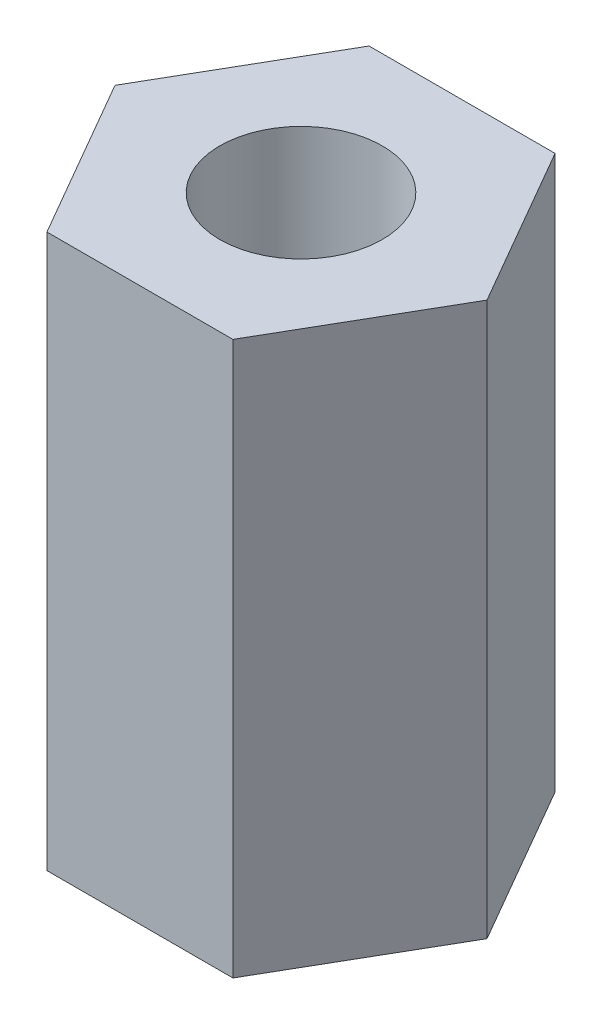
ISO-10303-21;
HEADER;
FILE_DESCRIPTION(('STEP AP214'),'2;1');
FILE_NAME('part.step','',(''),(''),'','','');
FILE_SCHEMA(('AUTOMOTIVE_DESIGN { 1 0 10303 214 1 1 1 1 }'));
ENDSEC;
DATA;
#1=APPLICATION_CONTEXT('core data for automotive mechanical design processes');
#2=APPLICATION_PROTOCOL_DEFINITION('international standard','automotive_design',2000,#1);
#3=PRODUCT_CONTEXT('',#1,'mechanical');
#4=PRODUCT('Part','Part','',(#3));
#5=PRODUCT_RELATED_PRODUCT_CATEGORY('part','',(#4));
#6=PRODUCT_DEFINITION_FORMATION('','',#4);
#7=PRODUCT_DEFINITION_CONTEXT('part definition',#1,'design');
#8=PRODUCT_DEFINITION('design','',#6,#7);
#9=PRODUCT_DEFINITION_SHAPE('','',#8);
#10=(LENGTH_UNIT() NAMED_UNIT(*) SI_UNIT(.MILLI.,.METRE.));
#11=(NAMED_UNIT(*) PLANE_ANGLE_UNIT() SI_UNIT($,.RADIAN.));
#12=(NAMED_UNIT(*) SI_UNIT($,.STERADIAN.) SOLID_ANGLE_UNIT());
#13=UNCERTAINTY_MEASURE_WITH_UNIT(LENGTH_MEASURE(1.E-05),#10,'distance_accuracy_value','');
#14=(GEOMETRIC_REPRESENTATION_CONTEXT(3) GLOBAL_UNCERTAINTY_ASSIGNED_CONTEXT((#13)) GLOBAL_UNIT_ASSIGNED_CONTEXT((#10,
#11,#12)) REPRESENTATION_CONTEXT('',''));
#15=CARTESIAN_POINT('',(0.,0.,0.));
#16=DIRECTION('',(0.,0.,1.));
#17=DIRECTION('',(1.,0.,0.));
#18=AXIS2_PLACEMENT_3D('',#15,#16,#17);
#19=CARTESIAN_POINT('',(0.,8.,0.));
#20=DIRECTION('',(0.,1.,0.));
#21=DIRECTION('',(0.,0.,1.));
#22=AXIS2_PLACEMENT_3D('',#19,#20,#21);
#23=PLANE('',#22);
#24=DIRECTION('',(0.499999999999995,0.,-0.866025403784441));
#25=VECTOR('',#24,1.);
#26=CARTESIAN_POINT('',(1.34522612721185,8.,2.32999999999998));
#27=LINE('',#26,#25);
#28=CARTESIAN_POINT('',(1.34522612721185,8.,2.32999999999998));
#29=VERTEX_POINT('',#28);
#30=CARTESIAN_POINT('',(2.69045225442365,8.,0.));
#31=VERTEX_POINT('',#30);
#32=EDGE_CURVE('E132',#29,#31,#27,.T.);
#33=ORIENTED_EDGE('',*,*,#32,.T.);
#34=DIRECTION('',(-0.500000000000001,0.,-0.866025403784438));
#35=VECTOR('',#34,1.);
#36=CARTESIAN_POINT('',(2.69045225442365,8.,0.));
#37=LINE('',#36,#35);
#38=CARTESIAN_POINT('',(1.34522612721182,8.,-2.33));
#39=VERTEX_POINT('',#38);
#40=EDGE_CURVE('E90',#31,#39,#37,.T.);
#41=ORIENTED_EDGE('',*,*,#40,.T.);
#42=DIRECTION('',(-1.,0.,0.));
#43=VECTOR('',#42,1.);
#44=CARTESIAN_POINT('',(1.34522612721182,8.,-2.33));
#45=LINE('',#44,#43);
#46=CARTESIAN_POINT('',(-1.34522612721184,8.,-2.32999999999999));
#47=VERTEX_POINT('',#46);
#48=EDGE_CURVE('E103',#39,#47,#45,.T.);
#49=ORIENTED_EDGE('',*,*,#48,.T.);
#50=DIRECTION('',(-0.499999999999995,0.,0.866025403784441));
#51=VECTOR('',#50,1.);
#52=CARTESIAN_POINT('',(-1.34522612721184,8.,-2.32999999999999));
#53=LINE('',#52,#51);
#54=CARTESIAN_POINT('',(-2.69045225442365,8.,0.));
#55=VERTEX_POINT('',#54);
#56=EDGE_CURVE('E97',#47,#55,#53,.T.);
#57=ORIENTED_EDGE('',*,*,#56,.T.);
#58=DIRECTION('',(0.500000000000007,0.,0.866025403784435));
#59=VECTOR('',#58,1.);
#60=CARTESIAN_POINT('',(-2.69045225442365,8.,0.));
#61=LINE('',#60,#59);
#62=CARTESIAN_POINT('',(-1.3452261272118,8.,2.33000000000001));
#63=VERTEX_POINT('',#62);
#64=EDGE_CURVE('E101',#55,#63,#61,.T.);
#65=ORIENTED_EDGE('',*,*,#64,.T.);
#66=DIRECTION('',(1.,0.,0.));
#67=VECTOR('',#66,1.);
#68=CARTESIAN_POINT('',(-1.3452261272118,8.,2.33000000000001));
#69=LINE('',#68,#67);
#70=EDGE_CURVE('E53',#63,#29,#69,.T.);
#71=ORIENTED_EDGE('',*,*,#70,.T.);
#72=EDGE_LOOP('',(#33,#41,#49,#57,#65,#71));
#73=FACE_BOUND('',#72,.T.);
#74=CARTESIAN_POINT('',(0.,8.,0.));
#75=DIRECTION('',(0.,1.,0.));
#76=DIRECTION('',(0.,0.,1.));
#77=AXIS2_PLACEMENT_3D('',#74,#75,#76);
#78=CIRCLE('',#77,1.175);
#79=CARTESIAN_POINT('',(0.,8.,1.175));
#80=VERTEX_POINT('',#79);
#81=EDGE_CURVE('E125',#80,#80,#78,.T.);
#82=ORIENTED_EDGE('',*,*,#81,.F.);
#83=EDGE_LOOP('',(#82));
#84=FACE_BOUND('',#83,.T.);
#85=ADVANCED_FACE('F36',(#73,#84),#23,.T.);
#86=CARTESIAN_POINT('',(0.,0.,0.));
#87=DIRECTION('',(0.,1.,0.));
#88=DIRECTION('',(0.,0.,1.));
#89=AXIS2_PLACEMENT_3D('',#86,#87,#88);
#90=PLANE('',#89);
#91=DIRECTION('',(0.499999999999995,0.,-0.866025403784441));
#92=VECTOR('',#91,1.);
#93=CARTESIAN_POINT('',(1.34522612721185,0.,2.32999999999998));
#94=LINE('',#93,#92);
#95=CARTESIAN_POINT('',(1.34522612721185,0.,2.32999999999998));
#96=VERTEX_POINT('',#95);
#97=CARTESIAN_POINT('',(2.69045225442365,0.,0.));
#98=VERTEX_POINT('',#97);
#99=EDGE_CURVE('E121',#96,#98,#94,.T.);
#100=ORIENTED_EDGE('',*,*,#99,.F.);
#101=DIRECTION('',(1.,0.,0.));
#102=VECTOR('',#101,1.);
#103=CARTESIAN_POINT('',(-1.3452261272118,0.,2.33000000000001));
#104=LINE('',#103,#102);
#105=CARTESIAN_POINT('',(-1.3452261272118,0.,2.33000000000001));
#106=VERTEX_POINT('',#105);
#107=EDGE_CURVE('E82',#106,#96,#104,.T.);
#108=ORIENTED_EDGE('',*,*,#107,.F.);
#109=DIRECTION('',(0.500000000000007,0.,0.866025403784435));
#110=VECTOR('',#109,1.);
#111=CARTESIAN_POINT('',(-2.69045225442365,0.,0.));
#112=LINE('',#111,#110);
#113=CARTESIAN_POINT('',(-2.69045225442365,0.,0.));
#114=VERTEX_POINT('',#113);
#115=EDGE_CURVE('E76',#114,#106,#112,.T.);
#116=ORIENTED_EDGE('',*,*,#115,.F.);
#117=DIRECTION('',(-0.499999999999995,0.,0.866025403784441));
#118=VECTOR('',#117,1.);
#119=CARTESIAN_POINT('',(-1.34522612721184,0.,-2.32999999999999));
#120=LINE('',#119,#118);
#121=CARTESIAN_POINT('',(-1.34522612721184,0.,-2.32999999999999));
#122=VERTEX_POINT('',#121);
#123=EDGE_CURVE('E111',#122,#114,#120,.T.);
#124=ORIENTED_EDGE('',*,*,#123,.F.);
#125=DIRECTION('',(-1.,0.,0.));
#126=VECTOR('',#125,1.);
#127=CARTESIAN_POINT('',(1.34522612721182,0.,-2.33));
#128=LINE('',#127,#126);
#129=CARTESIAN_POINT('',(1.34522612721182,0.,-2.33));
#130=VERTEX_POINT('',#129);
#131=EDGE_CURVE('E127',#130,#122,#128,.T.);
#132=ORIENTED_EDGE('',*,*,#131,.F.);
#133=DIRECTION('',(-0.500000000000001,0.,-0.866025403784438));
#134=VECTOR('',#133,1.);
#135=CARTESIAN_POINT('',(2.69045225442365,0.,0.));
#136=LINE('',#135,#134);
#137=EDGE_CURVE('E124',#98,#130,#136,.T.);
#138=ORIENTED_EDGE('',*,*,#137,.F.);
#139=EDGE_LOOP('',(#100,#108,#116,#124,#132,#138));
#140=FACE_BOUND('',#139,.T.);
#141=CARTESIAN_POINT('',(0.,0.,0.));
#142=DIRECTION('',(0.,1.,0.));
#143=DIRECTION('',(0.,0.,1.));
#144=AXIS2_PLACEMENT_3D('',#141,#142,#143);
#145=CIRCLE('',#144,1.175);
#146=CARTESIAN_POINT('',(0.,0.,1.175));
#147=VERTEX_POINT('',#146);
#148=EDGE_CURVE('E225',#147,#147,#145,.T.);
#149=ORIENTED_EDGE('',*,*,#148,.T.);
#150=EDGE_LOOP('',(#149));
#151=FACE_BOUND('',#150,.T.);
#152=ADVANCED_FACE('F141',(#140,#151),#90,.F.);
#153=CARTESIAN_POINT('',(1.34522612721185,8.,2.32999999999998));
#154=DIRECTION('',(-0.866025403784441,0.,-0.499999999999995));
#155=DIRECTION('',(-0.499999999999995,0.,0.866025403784442));
#156=AXIS2_PLACEMENT_3D('',#153,#154,#155);
#157=PLANE('',#156);
#158=ORIENTED_EDGE('',*,*,#99,.T.);
#159=DIRECTION('',(0.,-1.,0.));
#160=VECTOR('',#159,1.);
#161=CARTESIAN_POINT('',(2.69045225442365,8.,0.));
#162=LINE('',#161,#160);
#163=EDGE_CURVE('E11',#31,#98,#162,.T.);
#164=ORIENTED_EDGE('',*,*,#163,.F.);
#165=ORIENTED_EDGE('',*,*,#32,.F.);
#166=DIRECTION('',(0.,-1.,0.));
#167=VECTOR('',#166,1.);
#168=CARTESIAN_POINT('',(1.34522612721185,8.,2.32999999999998));
#169=LINE('',#168,#167);
#170=EDGE_CURVE('E117',#29,#96,#169,.T.);
#171=ORIENTED_EDGE('',*,*,#170,.T.);
#172=EDGE_LOOP('',(#158,#164,#165,#171));
#173=FACE_BOUND('',#172,.T.);
#174=ADVANCED_FACE('F38',(#173),#157,.F.);
#175=CARTESIAN_POINT('',(2.69045225442365,8.,0.));
#176=DIRECTION('',(-0.866025403784438,0.,0.500000000000001));
#177=DIRECTION('',(0.500000000000001,0.,0.866025403784438));
#178=AXIS2_PLACEMENT_3D('',#175,#176,#177);
#179=PLANE('',#178);
#180=ORIENTED_EDGE('',*,*,#137,.T.);
#181=DIRECTION('',(0.,-1.,0.));
#182=VECTOR('',#181,1.);
#183=CARTESIAN_POINT('',(1.34522612721182,8.,-2.33));
#184=LINE('',#183,#182);
#185=EDGE_CURVE('E45',#39,#130,#184,.T.);
#186=ORIENTED_EDGE('',*,*,#185,.F.);
#187=ORIENTED_EDGE('',*,*,#40,.F.);
#188=ORIENTED_EDGE('',*,*,#163,.T.);
#189=EDGE_LOOP('',(#180,#186,#187,#188));
#190=FACE_BOUND('',#189,.T.);
#191=ADVANCED_FACE('F166',(#190),#179,.F.);
#192=CARTESIAN_POINT('',(1.34522612721182,8.,-2.33));
#193=DIRECTION('',(0.,0.,1.));
#194=DIRECTION('',(1.,0.,0.));
#195=AXIS2_PLACEMENT_3D('',#192,#193,#194);
#196=PLANE('',#195);
#197=ORIENTED_EDGE('',*,*,#131,.T.);
#198=DIRECTION('',(0.,-1.,0.));
#199=VECTOR('',#198,1.);
#200=CARTESIAN_POINT('',(-1.34522612721184,8.,-2.32999999999999));
#201=LINE('',#200,#199);
#202=EDGE_CURVE('E112',#47,#122,#201,.T.);
#203=ORIENTED_EDGE('',*,*,#202,.F.);
#204=ORIENTED_EDGE('',*,*,#48,.F.);
#205=ORIENTED_EDGE('',*,*,#185,.T.);
#206=EDGE_LOOP('',(#197,#203,#204,#205));
#207=FACE_BOUND('',#206,.T.);
#208=ADVANCED_FACE('F138',(#207),#196,.F.);
#209=CARTESIAN_POINT('',(-1.34522612721184,8.,-2.32999999999999));
#210=DIRECTION('',(0.866025403784441,0.,0.499999999999995));
#211=DIRECTION('',(0.499999999999995,0.,-0.866025403784442));
#212=AXIS2_PLACEMENT_3D('',#209,#210,#211);
#213=PLANE('',#212);
#214=ORIENTED_EDGE('',*,*,#123,.T.);
#215=DIRECTION('',(0.,-1.,0.));
#216=VECTOR('',#215,1.);
#217=CARTESIAN_POINT('',(-2.69045225442365,8.,0.));
#218=LINE('',#217,#216);
#219=EDGE_CURVE('E108',#55,#114,#218,.T.);
#220=ORIENTED_EDGE('',*,*,#219,.F.);
#221=ORIENTED_EDGE('',*,*,#56,.F.);
#222=ORIENTED_EDGE('',*,*,#202,.T.);
#223=EDGE_LOOP('',(#214,#220,#221,#222));
#224=FACE_BOUND('',#223,.T.);
#225=ADVANCED_FACE('F109',(#224),#213,.F.);
#226=CARTESIAN_POINT('',(-2.69045225442365,8.,0.));
#227=DIRECTION('',(0.866025403784435,0.,-0.500000000000007));
#228=DIRECTION('',(-0.500000000000007,0.,-0.866025403784435));
#229=AXIS2_PLACEMENT_3D('',#226,#227,#228);
#230=PLANE('',#229);
#231=ORIENTED_EDGE('',*,*,#115,.T.);
#232=DIRECTION('',(0.,-1.,0.));
#233=VECTOR('',#232,1.);
#234=CARTESIAN_POINT('',(-1.3452261272118,8.,2.33000000000001));
#235=LINE('',#234,#233);
#236=EDGE_CURVE('E113',#63,#106,#235,.T.);
#237=ORIENTED_EDGE('',*,*,#236,.F.);
#238=ORIENTED_EDGE('',*,*,#64,.F.);
#239=ORIENTED_EDGE('',*,*,#219,.T.);
#240=EDGE_LOOP('',(#231,#237,#238,#239));
#241=FACE_BOUND('',#240,.T.);
#242=ADVANCED_FACE('F115',(#241),#230,.F.);
#243=CARTESIAN_POINT('',(-1.3452261272118,8.,2.33000000000001));
#244=DIRECTION('',(0.,0.,-1.));
#245=DIRECTION('',(-1.,0.,0.));
#246=AXIS2_PLACEMENT_3D('',#243,#244,#245);
#247=PLANE('',#246);
#248=ORIENTED_EDGE('',*,*,#107,.T.);
#249=ORIENTED_EDGE('',*,*,#170,.F.);
#250=ORIENTED_EDGE('',*,*,#70,.F.);
#251=ORIENTED_EDGE('',*,*,#236,.T.);
#252=EDGE_LOOP('',(#248,#249,#250,#251));
#253=FACE_BOUND('',#252,.T.);
#254=ADVANCED_FACE('F146',(#253),#247,.F.);
#255=CARTESIAN_POINT('',(0.,8.,0.));
#256=DIRECTION('',(0.,-1.,0.));
#257=DIRECTION('',(0.,0.,-1.));
#258=AXIS2_PLACEMENT_3D('',#255,#256,#257);
#259=CYLINDRICAL_SURFACE('',#258,1.175);
#260=ORIENTED_EDGE('',*,*,#81,.T.);
#261=EDGE_LOOP('',(#260));
#262=FACE_BOUND('',#261,.T.);
#263=ORIENTED_EDGE('',*,*,#148,.F.);
#264=EDGE_LOOP('',(#263));
#265=FACE_BOUND('',#264,.T.);
#266=ADVANCED_FACE('F148',(#262,#265),#259,.F.);
#267=CLOSED_SHELL('',(#85,#152,#174,#191,#208,#225,#242,#254,#266));
#268=MANIFOLD_SOLID_BREP('B2',#267);
#269=ADVANCED_BREP_SHAPE_REPRESENTATION('',(#18,#268),#14);
#270=SHAPE_DEFINITION_REPRESENTATION(#9,#269);
ENDSEC;
END-ISO-10303-21;
